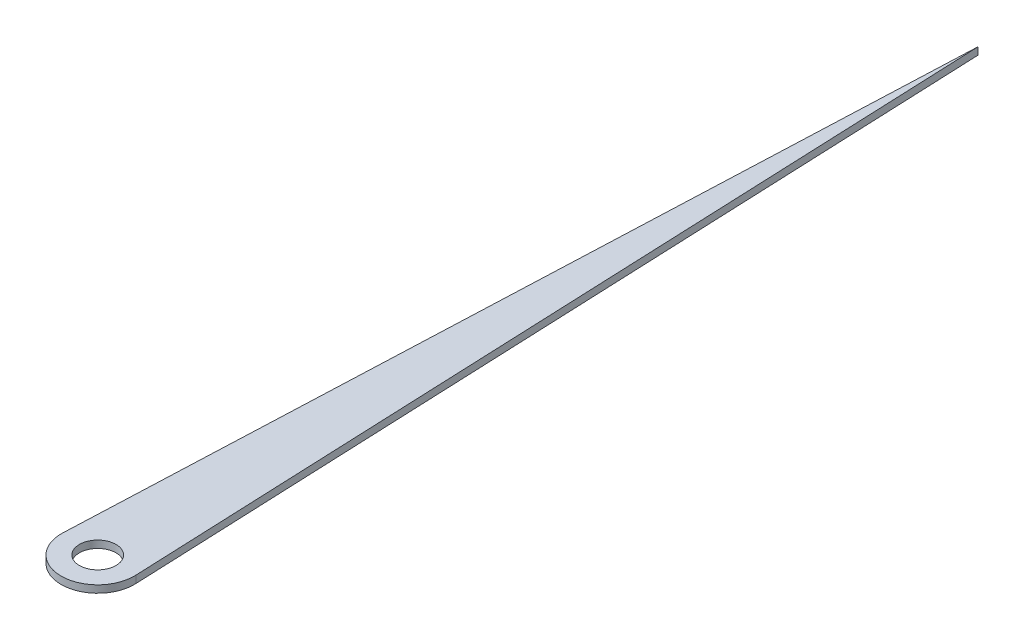
ISO-10303-21;
HEADER;
FILE_DESCRIPTION(('STEP AP214'),'2;1');
FILE_NAME('part.step','',(''),(''),'','','');
FILE_SCHEMA(('AUTOMOTIVE_DESIGN { 1 0 10303 214 1 1 1 1 }'));
ENDSEC;
DATA;
#1=APPLICATION_CONTEXT('core data for automotive mechanical design processes');
#2=APPLICATION_PROTOCOL_DEFINITION('international standard','automotive_design',2000,#1);
#3=PRODUCT_CONTEXT('',#1,'mechanical');
#4=PRODUCT('Part','Part','',(#3));
#5=PRODUCT_RELATED_PRODUCT_CATEGORY('part','',(#4));
#6=PRODUCT_DEFINITION_FORMATION('','',#4);
#7=PRODUCT_DEFINITION_CONTEXT('part definition',#1,'design');
#8=PRODUCT_DEFINITION('design','',#6,#7);
#9=PRODUCT_DEFINITION_SHAPE('','',#8);
#10=(LENGTH_UNIT() NAMED_UNIT(*) SI_UNIT(.MILLI.,.METRE.));
#11=(NAMED_UNIT(*) PLANE_ANGLE_UNIT() SI_UNIT($,.RADIAN.));
#12=(NAMED_UNIT(*) SI_UNIT($,.STERADIAN.) SOLID_ANGLE_UNIT());
#13=UNCERTAINTY_MEASURE_WITH_UNIT(LENGTH_MEASURE(1.E-05),#10,'distance_accuracy_value','');
#14=(GEOMETRIC_REPRESENTATION_CONTEXT(3) GLOBAL_UNCERTAINTY_ASSIGNED_CONTEXT((#13)) GLOBAL_UNIT_ASSIGNED_CONTEXT((#10,
#11,#12)) REPRESENTATION_CONTEXT('',''));
#15=CARTESIAN_POINT('',(0.,0.,0.));
#16=DIRECTION('',(0.,0.,1.));
#17=DIRECTION('',(1.,0.,0.));
#18=AXIS2_PLACEMENT_3D('',#15,#16,#17);
#19=CARTESIAN_POINT('',(0.0959661676135408,0.254,0.00399288073264556));
#20=DIRECTION('',(0.999135543886472,0.,0.0415712032864667));
#21=DIRECTION('',(0.0415712032864667,0.,-0.999135543886472));
#22=AXIS2_PLACEMENT_3D('',#19,#20,#21);
#23=PLANE('',#22);
#24=DIRECTION('',(-0.0415712032864667,0.,0.999135543886472));
#25=VECTOR('',#24,1.);
#26=CARTESIAN_POINT('',(0.0959661676135408,0.,0.00399288073264556));
#27=LINE('',#26,#25);
#28=CARTESIAN_POINT('',(1.37178273182201,0.,-30.6593888837008));
#29=VERTEX_POINT('',#28);
#30=CARTESIAN_POINT('',(0.102880591086192,0.,-0.162190575863561));
#31=VERTEX_POINT('',#30);
#32=EDGE_CURVE('E65',#29,#31,#27,.T.);
#33=ORIENTED_EDGE('',*,*,#32,.T.);
#34=DIRECTION('',(0.,-1.,0.));
#35=VECTOR('',#34,1.);
#36=CARTESIAN_POINT('',(0.102880591086192,0.254,-0.162190575863561));
#37=LINE('',#36,#35);
#38=CARTESIAN_POINT('',(0.102880591086192,0.254,-0.162190575863561));
#39=VERTEX_POINT('',#38);
#40=EDGE_CURVE('E11',#39,#31,#37,.T.);
#41=ORIENTED_EDGE('',*,*,#40,.F.);
#42=DIRECTION('',(-0.0415712032864667,0.,0.999135543886472));
#43=VECTOR('',#42,1.);
#44=CARTESIAN_POINT('',(0.0959661676135408,0.254,0.00399288073264556));
#45=LINE('',#44,#43);
#46=CARTESIAN_POINT('',(1.37178273182201,0.254,-30.6593888837008));
#47=VERTEX_POINT('',#46);
#48=EDGE_CURVE('E56',#47,#39,#45,.T.);
#49=ORIENTED_EDGE('',*,*,#48,.F.);
#50=DIRECTION('',(0.,-1.,0.));
#51=VECTOR('',#50,1.);
#52=CARTESIAN_POINT('',(1.37178273182201,0.254,-30.6593888837008));
#53=LINE('',#52,#51);
#54=EDGE_CURVE('E66',#47,#29,#53,.T.);
#55=ORIENTED_EDGE('',*,*,#54,.T.);
#56=EDGE_LOOP('',(#33,#41,#49,#55));
#57=FACE_BOUND('',#56,.T.);
#58=ADVANCED_FACE('F16',(#57),#23,.F.);
#59=CARTESIAN_POINT('',(1.37178273182201,0.254,-0.109395147689748));
#60=DIRECTION('',(0.,-1.,0.));
#61=DIRECTION('',(0.,0.,-1.));
#62=AXIS2_PLACEMENT_3D('',#59,#60,#61);
#63=CYLINDRICAL_SURFACE('',#62,1.27);
#64=CARTESIAN_POINT('',(1.37178273182201,0.,-0.109395147689748));
#65=DIRECTION('',(0.,1.,0.));
#66=DIRECTION('',(0.,0.,1.));
#67=AXIS2_PLACEMENT_3D('',#64,#65,#66);
#68=CIRCLE('',#67,1.27);
#69=CARTESIAN_POINT('',(2.64068487255783,0.,-0.162190575863561));
#70=VERTEX_POINT('',#69);
#71=EDGE_CURVE('E44',#31,#70,#68,.T.);
#72=ORIENTED_EDGE('',*,*,#71,.T.);
#73=DIRECTION('',(0.,-1.,0.));
#74=VECTOR('',#73,1.);
#75=CARTESIAN_POINT('',(2.64068487255783,0.254,-0.162190575863561));
#76=LINE('',#75,#74);
#77=CARTESIAN_POINT('',(2.64068487255783,0.254,-0.162190575863561));
#78=VERTEX_POINT('',#77);
#79=EDGE_CURVE('E24',#78,#70,#76,.T.);
#80=ORIENTED_EDGE('',*,*,#79,.F.);
#81=CARTESIAN_POINT('',(1.37178273182201,0.254,-0.109395147689748));
#82=DIRECTION('',(0.,1.,0.));
#83=DIRECTION('',(0.,0.,1.));
#84=AXIS2_PLACEMENT_3D('',#81,#82,#83);
#85=CIRCLE('',#84,1.27);
#86=EDGE_CURVE('E52',#39,#78,#85,.T.);
#87=ORIENTED_EDGE('',*,*,#86,.F.);
#88=ORIENTED_EDGE('',*,*,#40,.T.);
#89=EDGE_LOOP('',(#72,#80,#87,#88));
#90=FACE_BOUND('',#89,.T.);
#91=ADVANCED_FACE('F53',(#90),#63,.T.);
#92=CARTESIAN_POINT('',(2.64285796237825,0.254,-0.109961842798545));
#93=DIRECTION('',(-0.999135543886472,0.,0.0415712032864667));
#94=DIRECTION('',(0.0415712032864667,0.,0.999135543886472));
#95=AXIS2_PLACEMENT_3D('',#92,#93,#94);
#96=PLANE('',#95);
#97=DIRECTION('',(-0.0415712032864667,0.,-0.999135543886472));
#98=VECTOR('',#97,1.);
#99=CARTESIAN_POINT('',(2.64285796237825,0.,-0.109961842798545));
#100=LINE('',#99,#98);
#101=EDGE_CURVE('E49',#70,#29,#100,.T.);
#102=ORIENTED_EDGE('',*,*,#101,.T.);
#103=ORIENTED_EDGE('',*,*,#54,.F.);
#104=DIRECTION('',(-0.0415712032864667,0.,-0.999135543886472));
#105=VECTOR('',#104,1.);
#106=CARTESIAN_POINT('',(2.64285796237825,0.254,-0.109961842798545));
#107=LINE('',#106,#105);
#108=EDGE_CURVE('E32',#78,#47,#107,.T.);
#109=ORIENTED_EDGE('',*,*,#108,.F.);
#110=ORIENTED_EDGE('',*,*,#79,.T.);
#111=EDGE_LOOP('',(#102,#103,#109,#110));
#112=FACE_BOUND('',#111,.T.);
#113=ADVANCED_FACE('F77',(#112),#96,.F.);
#114=CARTESIAN_POINT('',(1.37178273182201,0.254,-0.109395147689748));
#115=DIRECTION('',(0.,-1.,0.));
#116=DIRECTION('',(0.,0.,-1.));
#117=AXIS2_PLACEMENT_3D('',#114,#115,#116);
#118=CYLINDRICAL_SURFACE('',#117,0.635);
#119=CARTESIAN_POINT('',(1.37178273182201,0.254,-0.109395147689748));
#120=DIRECTION('',(0.,1.,0.));
#121=DIRECTION('',(0.,0.,1.));
#122=AXIS2_PLACEMENT_3D('',#119,#120,#121);
#123=CIRCLE('',#122,0.635);
#124=CARTESIAN_POINT('',(1.37178273182201,0.254,0.525604852310252));
#125=VERTEX_POINT('',#124);
#126=EDGE_CURVE('E71',#125,#125,#123,.T.);
#127=ORIENTED_EDGE('',*,*,#126,.T.);
#128=EDGE_LOOP('',(#127));
#129=FACE_BOUND('',#128,.T.);
#130=CARTESIAN_POINT('',(1.37178273182201,0.,-0.109395147689748));
#131=DIRECTION('',(0.,1.,0.));
#132=DIRECTION('',(0.,0.,1.));
#133=AXIS2_PLACEMENT_3D('',#130,#131,#132);
#134=CIRCLE('',#133,0.635);
#135=CARTESIAN_POINT('',(1.37178273182201,0.,0.525604852310252));
#136=VERTEX_POINT('',#135);
#137=EDGE_CURVE('E62',#136,#136,#134,.T.);
#138=ORIENTED_EDGE('',*,*,#137,.F.);
#139=EDGE_LOOP('',(#138));
#140=FACE_BOUND('',#139,.T.);
#141=ADVANCED_FACE('F84',(#129,#140),#118,.F.);
#142=CARTESIAN_POINT('',(0.,0.254,0.));
#143=DIRECTION('',(0.,1.,0.));
#144=DIRECTION('',(0.,0.,1.));
#145=AXIS2_PLACEMENT_3D('',#142,#143,#144);
#146=PLANE('',#145);
#147=ORIENTED_EDGE('',*,*,#48,.T.);
#148=ORIENTED_EDGE('',*,*,#86,.T.);
#149=ORIENTED_EDGE('',*,*,#108,.T.);
#150=EDGE_LOOP('',(#147,#148,#149));
#151=FACE_BOUND('',#150,.T.);
#152=ORIENTED_EDGE('',*,*,#126,.F.);
#153=EDGE_LOOP('',(#152));
#154=FACE_BOUND('',#153,.T.);
#155=ADVANCED_FACE('F59',(#151,#154),#146,.T.);
#156=CARTESIAN_POINT('',(0.,0.,0.));
#157=DIRECTION('',(0.,1.,0.));
#158=DIRECTION('',(0.,0.,1.));
#159=AXIS2_PLACEMENT_3D('',#156,#157,#158);
#160=PLANE('',#159);
#161=ORIENTED_EDGE('',*,*,#32,.F.);
#162=ORIENTED_EDGE('',*,*,#101,.F.);
#163=ORIENTED_EDGE('',*,*,#71,.F.);
#164=EDGE_LOOP('',(#161,#162,#163));
#165=FACE_BOUND('',#164,.T.);
#166=ORIENTED_EDGE('',*,*,#137,.T.);
#167=EDGE_LOOP('',(#166));
#168=FACE_BOUND('',#167,.T.);
#169=ADVANCED_FACE('F78',(#165,#168),#160,.F.);
#170=CLOSED_SHELL('',(#58,#91,#113,#141,#155,#169));
#171=MANIFOLD_SOLID_BREP('B1',#170);
#172=ADVANCED_BREP_SHAPE_REPRESENTATION('',(#18,#171),#14);
#173=SHAPE_DEFINITION_REPRESENTATION(#9,#172);
ENDSEC;
END-ISO-10303-21;
